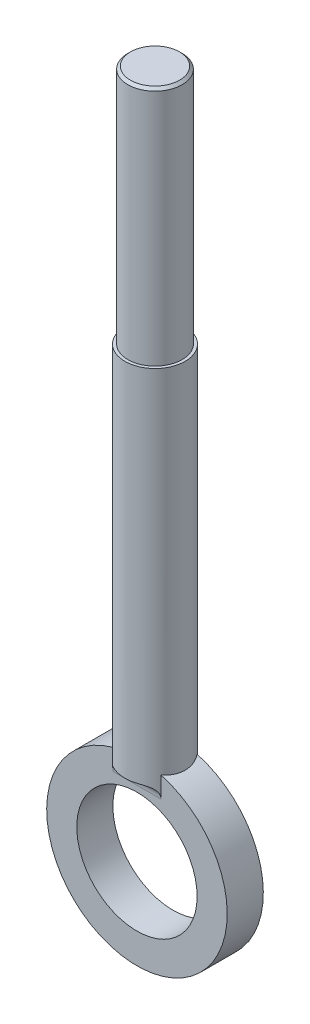
ISO-10303-21;
HEADER;
FILE_DESCRIPTION(('STEP AP214'),'2;1');
FILE_NAME('part.step','',(''),(''),'','','');
FILE_SCHEMA(('AUTOMOTIVE_DESIGN { 1 0 10303 214 1 1 1 1 }'));
ENDSEC;
DATA;
#1=APPLICATION_CONTEXT('core data for automotive mechanical design processes');
#2=APPLICATION_PROTOCOL_DEFINITION('international standard','automotive_design',2000,#1);
#3=PRODUCT_CONTEXT('',#1,'mechanical');
#4=PRODUCT('Part','Part','',(#3));
#5=PRODUCT_RELATED_PRODUCT_CATEGORY('part','',(#4));
#6=PRODUCT_DEFINITION_FORMATION('','',#4);
#7=PRODUCT_DEFINITION_CONTEXT('part definition',#1,'design');
#8=PRODUCT_DEFINITION('design','',#6,#7);
#9=PRODUCT_DEFINITION_SHAPE('','',#8);
#10=(LENGTH_UNIT() NAMED_UNIT(*) SI_UNIT(.MILLI.,.METRE.));
#11=(NAMED_UNIT(*) PLANE_ANGLE_UNIT() SI_UNIT($,.RADIAN.));
#12=(NAMED_UNIT(*) SI_UNIT($,.STERADIAN.) SOLID_ANGLE_UNIT());
#13=UNCERTAINTY_MEASURE_WITH_UNIT(LENGTH_MEASURE(1.E-05),#10,'distance_accuracy_value','');
#14=(GEOMETRIC_REPRESENTATION_CONTEXT(3) GLOBAL_UNCERTAINTY_ASSIGNED_CONTEXT((#13)) GLOBAL_UNIT_ASSIGNED_CONTEXT((#10,
#11,#12)) REPRESENTATION_CONTEXT('',''));
#15=CARTESIAN_POINT('',(0.,0.,0.));
#16=DIRECTION('',(0.,0.,1.));
#17=DIRECTION('',(1.,0.,0.));
#18=AXIS2_PLACEMENT_3D('',#15,#16,#17);
#19=CARTESIAN_POINT('',(0.,50.,0.));
#20=DIRECTION('',(0.,-1.,0.));
#21=DIRECTION('',(0.,0.,-1.));
#22=AXIS2_PLACEMENT_3D('',#19,#20,#21);
#23=CYLINDRICAL_SURFACE('',#22,2.5);
#24=CARTESIAN_POINT('',(0.,30.,0.));
#25=DIRECTION('',(0.,-1.,0.));
#26=DIRECTION('',(0.,0.,-1.));
#27=AXIS2_PLACEMENT_3D('',#24,#25,#26);
#28=CIRCLE('',#27,2.5);
#29=CARTESIAN_POINT('',(0.,30.,-2.5));
#30=VERTEX_POINT('',#29);
#31=EDGE_CURVE('E161',#30,#30,#28,.T.);
#32=ORIENTED_EDGE('',*,*,#31,.T.);
#33=EDGE_LOOP('',(#32));
#34=FACE_BOUND('',#33,.T.);
#35=DIRECTION('',(0.,-1.,0.));
#36=VECTOR('',#35,1.);
#37=CARTESIAN_POINT('',(-2.,50.,-1.5));
#38=LINE('',#37,#36);
#39=CARTESIAN_POINT('',(-2.,0.728416147400481,-1.5));
#40=VERTEX_POINT('',#39);
#41=CARTESIAN_POINT('',(-2.,-1.,-1.5));
#42=VERTEX_POINT('',#41);
#43=EDGE_CURVE('E108',#40,#42,#38,.T.);
#44=ORIENTED_EDGE('',*,*,#43,.F.);
#45=CARTESIAN_POINT('',(0.,1.,-2.5));
#46=CARTESIAN_POINT('',(-0.136408407216808,1.0000003825236,-2.5000006343291));
#47=CARTESIAN_POINT('',(-0.272812986346375,0.996244237688619,-2.48879933468196));
#48=CARTESIAN_POINT('',(-0.54160440218243,0.981630255082018,-2.44442722795695));
#49=CARTESIAN_POINT('',(-0.673990820297044,0.970771680053813,-2.41125414012769));
#50=CARTESIAN_POINT('',(-0.93083197375444,0.943132697661065,-2.32420189153988));
#51=CARTESIAN_POINT('',(-1.05529956471509,0.926362193271333,-2.27035734385182));
#52=CARTESIAN_POINT('',(-1.29343734201331,0.888611142933544,-2.14364706790413));
#53=CARTESIAN_POINT('',(-1.40710539239676,0.867629766694449,-2.0707775874935));
#54=CARTESIAN_POINT('',(-1.62435418755567,0.822852361075126,-1.90543548785312));
#55=CARTESIAN_POINT('',(-1.72750925074577,0.798988911594621,-1.81242191434877));
#56=CARTESIAN_POINT('',(-1.91708173175521,0.751507869578036,-1.61058211323358));
#57=CARTESIAN_POINT('',(-2.00349546372366,0.727890332263727,-1.50175241267872));
#58=CARTESIAN_POINT('',(-2.15956235556965,0.682833311931844,-1.26753721200885));
#59=CARTESIAN_POINT('',(-2.22866214555258,0.661475981892204,-1.14176565066969));
#60=CARTESIAN_POINT('',(-2.3445471846943,0.624382635465029,-0.879559763853632));
#61=CARTESIAN_POINT('',(-2.39133924346691,0.608644904018641,-0.74312870709314));
#62=CARTESIAN_POINT('',(-2.45968365377291,0.585282581734432,-0.468316946258224));
#63=CARTESIAN_POINT('',(-2.48203362067942,0.577402394240282,-0.330156978777338));
#64=CARTESIAN_POINT('',(-2.50335280833619,0.569891415737688,-0.0518406146102977));
#65=CARTESIAN_POINT('',(-2.50232925401179,0.570258075568249,0.0883151517729762));
#66=CARTESIAN_POINT('',(-2.47754975925855,0.578975375204504,0.359841576110053));
#67=CARTESIAN_POINT('',(-2.45483478291749,0.586960396688323,0.491321007297546));
#68=CARTESIAN_POINT('',(-2.38901540712354,0.609416443113773,0.748483549017085));
#69=CARTESIAN_POINT('',(-2.34590856647968,0.62388824460269,0.874165963587674));
#70=CARTESIAN_POINT('',(-2.23984764515053,0.65794777828122,1.1185318739787));
#71=CARTESIAN_POINT('',(-2.17658512176816,0.677614144827934,1.23707006367381));
#72=CARTESIAN_POINT('',(-2.03222276575785,0.719813964393161,1.46217727069931));
#73=CARTESIAN_POINT('',(-1.95111778091001,0.742348244761589,1.56874281733345));
#74=CARTESIAN_POINT('',(-1.76837333170559,0.789183229193522,1.77272899540193));
#75=CARTESIAN_POINT('',(-1.66588287519078,0.813514733871071,1.86938173627267));
#76=CARTESIAN_POINT('',(-1.44584892492516,0.860173459675917,2.04432816665849));
#77=CARTESIAN_POINT('',(-1.32830398915204,0.882500488451685,2.12262009541124));
#78=CARTESIAN_POINT('',(-1.07986903261567,0.92292769844484,2.25924075058767));
#79=CARTESIAN_POINT('',(-0.948858191040841,0.94098375020098,2.31736372835183));
#80=CARTESIAN_POINT('',(-0.678172708411269,0.97051417861087,2.41050793488928));
#81=CARTESIAN_POINT('',(-0.538501095387384,0.98199084137198,2.44553718855859));
#82=CARTESIAN_POINT('',(-0.26095957382326,0.99669067678601,2.4901391650559));
#83=CARTESIAN_POINT('',(-0.123273999662116,1.0002500458432,2.50074952293188));
#84=CARTESIAN_POINT('',(0.151937674900593,0.999722567370685,2.49916831600383));
#85=CARTESIAN_POINT('',(0.289463798299125,0.995637010484057,2.48698060005031));
#86=CARTESIAN_POINT('',(0.556299665760637,0.980500617927606,2.4409702306601));
#87=CARTESIAN_POINT('',(0.685732017087107,0.969654967779807,2.40778448487626));
#88=CARTESIAN_POINT('',(0.937139896448932,0.942296170751748,2.32151638883318));
#89=CARTESIAN_POINT('',(1.05911447127151,0.925782301166876,2.26843150133054));
#90=CARTESIAN_POINT('',(1.29572074098318,0.888223282182245,2.14232392039803));
#91=CARTESIAN_POINT('',(1.41007489804287,0.867070368894653,2.06881351679207));
#92=CARTESIAN_POINT('',(1.62516207533896,0.822631347906562,1.90451462496629));
#93=CARTESIAN_POINT('',(1.72589091948894,0.79934458984569,1.81372085992059));
#94=CARTESIAN_POINT('',(1.91563126951575,0.751921199511118,1.61255312248353));
#95=CARTESIAN_POINT('',(2.00390242311443,0.727794027185698,1.50147693268285));
#96=CARTESIAN_POINT('',(2.16064380580894,0.682499332367717,1.26557108047278));
#97=CARTESIAN_POINT('',(2.22911386982753,0.661331834550058,1.14074130341481));
#98=CARTESIAN_POINT('',(2.3439923260409,0.624559794784588,0.88081746177526));
#99=CARTESIAN_POINT('',(2.39044533041255,0.60894401982447,0.745744802078086));
#100=CARTESIAN_POINT('',(2.45973666689839,0.585270807661238,0.469053374889674));
#101=CARTESIAN_POINT('',(2.48258563738485,0.577209965590984,0.327437586489127));
#102=CARTESIAN_POINT('',(2.50319070619335,0.56994647185443,0.0495072598977102));
#103=CARTESIAN_POINT('',(2.502175643271,0.570310006435378,-0.0867058507170575));
#104=CARTESIAN_POINT('',(2.47810573362173,0.578781745596685,-0.356912687305155));
#105=CARTESIAN_POINT('',(2.45505219864646,0.586889489234042,-0.49090654488772));
#106=CARTESIAN_POINT('',(2.38842953282336,0.609613107622292,-0.750339157506179));
#107=CARTESIAN_POINT('',(2.34525836503878,0.624102450561938,-0.875892062511239));
#108=CARTESIAN_POINT('',(2.23994841439937,0.657909970461713,-1.11806851734567));
#109=CARTESIAN_POINT('',(2.17780542138451,0.677229219084828,-1.23469007797002));
#110=CARTESIAN_POINT('',(2.03315173145857,0.719570730651156,-1.46120917480728));
#111=CARTESIAN_POINT('',(1.94987060691145,0.742717791053426,-1.57059125474596));
#112=CARTESIAN_POINT('',(1.76660720783912,0.789583907081321,-1.7742245334605));
#113=CARTESIAN_POINT('',(1.6666202111287,0.813303122809307,-1.86847143922019));
#114=CARTESIAN_POINT('',(1.44810389230172,0.859750763138604,-2.04286103072294));
#115=CARTESIAN_POINT('',(1.32900378374932,0.882404545031416,-2.1223108693775));
#116=CARTESIAN_POINT('',(1.07839339351656,0.923149779315301,-2.25997607212662));
#117=CARTESIAN_POINT('',(0.946886295330872,0.941242397698245,-2.3181968648051));
#118=CARTESIAN_POINT('',(0.68123411800244,0.970137876713546,-2.40930408122168));
#119=CARTESIAN_POINT('',(0.547469394191021,0.981230310563067,-2.44320616565844));
#120=CARTESIAN_POINT('',(0.275801040025617,0.996160176605546,-2.48855070169281));
#121=CARTESIAN_POINT('',(0.137898563921866,0.999999613297624,-2.49999935874134));
#122=CARTESIAN_POINT('',(0.,1.,-2.5));
#123=B_SPLINE_CURVE_WITH_KNOTS('',3,(#45,#46,#47,#48,#49,#50,#51,#52,#53,#54,#55,#56,#57,#58,
#59,#60,#61,#62,#63,#64,#65,#66,#67,#68,#69,#70,#71,#72,#73,#74,#75,#76,#77,#78,#79,#80,#81,#82,
#83,#84,#85,#86,#87,#88,#89,#90,#91,#92,#93,#94,#95,#96,#97,#98,#99,#100,#101,#102,#103,#104,
#105,#106,#107,#108,#109,#110,#111,#112,#113,#114,#115,#116,#117,#118,#119,#120,#121,#122),
.UNSPECIFIED.,.T.,.F.,(4,2,2,2,2,2,2,2,2,2,2,2,2,2,2,2,2,2,2,2,2,2,2,2,2,2,2,2,2,2,2,2,2,2,2,2,
2,2,4),(0.,0.408717765065027,0.817477963168801,1.22555668217568,1.63371594449775,
2.0546171070689,2.47561083218826,2.90870962058676,3.34167611732083,3.760048143546,
4.17829084968713,4.577420663782,4.97659827138705,5.38220427887826,5.78792756395518,
6.21483264528417,6.64177864916546,7.07296014125894,7.5039917219302,7.91633957937924,
8.32861782910441,8.72895394945533,9.12934113210259,9.54025999609341,9.95130452054728,
10.3810255720188,10.8107502058749,11.2396003456693,11.668257117646,12.0748916516065,
12.4815019837844,12.8803896770104,13.2793659543994,13.6957516672951,14.1122552780945,
14.5449915208775,14.9776170288114,15.3909139593453,15.8040966509535),.UNSPECIFIED.);
#124=CARTESIAN_POINT('',(-2.,0.728416147400481,1.5));
#125=VERTEX_POINT('',#124);
#126=EDGE_CURVE('E107',#40,#125,#123,.T.);
#127=ORIENTED_EDGE('',*,*,#126,.T.);
#128=DIRECTION('',(0.,-1.,0.));
#129=VECTOR('',#128,1.);
#130=CARTESIAN_POINT('',(-2.,50.,1.5));
#131=LINE('',#130,#129);
#132=CARTESIAN_POINT('',(-2.,-1.,1.5));
#133=VERTEX_POINT('',#132);
#134=EDGE_CURVE('E111',#125,#133,#131,.T.);
#135=ORIENTED_EDGE('',*,*,#134,.T.);
#136=CARTESIAN_POINT('',(-2.,-1.,1.5));
#137=CARTESIAN_POINT('',(-1.99999876577342,-0.97676225149139,1.49999830084557));
#138=CARTESIAN_POINT('',(-1.99939222254472,-0.953536308819546,1.50081072058559));
#139=CARTESIAN_POINT('',(-1.99696568946245,-0.907264468753069,1.50403926587182));
#140=CARTESIAN_POINT('',(-1.99514593772813,-0.884218536925133,1.50645507671632));
#141=CARTESIAN_POINT('',(-1.98788221987231,-0.815759602078507,1.5160449621284));
#142=CARTESIAN_POINT('',(-1.98063378832018,-0.770832093704825,1.52556192920814));
#143=CARTESIAN_POINT('',(-1.96135768732922,-0.683683781130424,1.55026368463543));
#144=CARTESIAN_POINT('',(-1.94933054307276,-0.641462680086458,1.56544785014457));
#145=CARTESIAN_POINT('',(-1.92060500353691,-0.560747353683061,1.60055891928685));
#146=CARTESIAN_POINT('',(-1.90390550189449,-0.522254013926215,1.62048694604742));
#147=CARTESIAN_POINT('',(-1.8655642210059,-0.448809561599657,1.66449377708559));
#148=CARTESIAN_POINT('',(-1.84380444693772,-0.413977638233013,1.68866762969594));
#149=CARTESIAN_POINT('',(-1.79598412356434,-0.34942934593038,1.73944251511171));
#150=CARTESIAN_POINT('',(-1.76992133886495,-0.319715652371747,1.76604480625132));
#151=CARTESIAN_POINT('',(-1.70282056041735,-0.254605991726268,1.83121713206997));
#152=CARTESIAN_POINT('',(-1.65994913666013,-0.221649805543534,1.87033920684536));
#153=CARTESIAN_POINT('',(-1.56811242052649,-0.164767780457878,1.94798747224093));
#154=CARTESIAN_POINT('',(-1.51913642777315,-0.140858103247096,1.98651247957849));
#155=CARTESIAN_POINT('',(-1.43107648771638,-0.106263089760478,2.05038747818235));
#156=CARTESIAN_POINT('',(-1.3931377213115,-0.0937505866711835,2.07636980470312));
#157=CARTESIAN_POINT('',(-1.31522219267615,-0.071934583669212,2.12657994269479));
#158=CARTESIAN_POINT('',(-1.2752445398744,-0.0626325000648118,2.15080697608663));
#159=CARTESIAN_POINT('',(-1.15260387917798,-0.0386093300991319,2.22043345824846));
#160=CARTESIAN_POINT('',(-1.06735328624028,-0.0278137690861297,2.26269041498312));
#161=CARTESIAN_POINT('',(-0.918304249672437,-0.0148598287067491,2.32620256664635));
#162=CARTESIAN_POINT('',(-0.855658332747251,-0.0110881716216496,2.34996728629104));
#163=CARTESIAN_POINT('',(-0.728538148866373,-0.00557114346597338,2.39242889075479));
#164=CARTESIAN_POINT('',(-0.664063015465104,-0.00382674963725299,2.41112332811937));
#165=CARTESIAN_POINT('',(-0.533896458793061,-0.00148243349274305,2.44324512662257));
#166=CARTESIAN_POINT('',(-0.468206760857007,-0.000880997357431536,2.45667943590986));
#167=CARTESIAN_POINT('',(-0.335989634988424,-0.000178686641797203,2.47822361899857));
#168=CARTESIAN_POINT('',(-0.269462733477933,-7.75118670290784E-05,2.48633668341112));
#169=CARTESIAN_POINT('',(-0.168986828099427,-1.1840965284829E-05,2.49451214519894));
#170=CARTESIAN_POINT('',(-0.135189174611832,-4.50495384289952E-06,2.49657170199025));
#171=CARTESIAN_POINT('',(-0.0675955437350746,2.76106166190426E-07,2.49931444186999));
#172=CARTESIAN_POINT('',(-0.0337996609302274,-2.26207288891659E-06,2.49999995591882));
#173=CARTESIAN_POINT('',(0.,0.,2.5));
#174=B_SPLINE_CURVE_WITH_KNOTS('',3,(#136,#137,#138,#139,#140,#141,#142,#143,#144,#145,#146,
#147,#148,#149,#150,#151,#152,#153,#154,#155,#156,#157,#158,#159,#160,#161,#162,#163,#164,#165,
#166,#167,#168,#169,#170,#171,#172,#173),.UNSPECIFIED.,.F.,.F.,(4,2,2,2,2,2,2,2,2,2,2,2,2,2,2,2,
2,2,4),(0.,0.0696679256697032,0.139322181478205,0.278058417432403,0.416779410436504,
0.555533278891727,0.697921487377381,0.840383899982874,1.0395031865621,1.23897654099019,
1.38175148916954,1.52458934365607,1.81072382391384,2.01183769876063,2.21304848035171,
2.41399257693819,2.61481607730566,2.71637299528517,2.81775748326735),.UNSPECIFIED.);
#175=CARTESIAN_POINT('',(0.,0.,2.5));
#176=VERTEX_POINT('',#175);
#177=EDGE_CURVE('E11',#133,#176,#174,.T.);
#178=ORIENTED_EDGE('',*,*,#177,.T.);
#179=CARTESIAN_POINT('',(0.,0.,2.5));
#180=CARTESIAN_POINT('',(0.0349463276174826,-2.58721338670035E-06,2.5000000597369));
#181=CARTESIAN_POINT('',(0.069888684787882,3.13420399071013E-07,2.49926717858351));
#182=CARTESIAN_POINT('',(0.139711327944131,-5.14276056735741E-06,2.49633767314956));
#183=CARTESIAN_POINT('',(0.174591615079841,-1.34993645566535E-05,2.49414107627372));
#184=CARTESIAN_POINT('',(0.279086404267144,-8.882164115308E-05,2.48535667104289));
#185=CARTESIAN_POINT('',(0.348528399610689,-0.00020607136882789,2.47657425082874));
#186=CARTESIAN_POINT('',(0.486965770610719,-0.00102980398859722,2.45312652750474));
#187=CARTESIAN_POINT('',(0.555953415920908,-0.00174088415415931,2.43841579017993));
#188=CARTESIAN_POINT('',(0.692372474016579,-0.00453676680161278,2.40324533658573));
#189=CARTESIAN_POINT('',(0.759804545499893,-0.00662097636379104,2.38278810384935));
#190=CARTESIAN_POINT('',(0.922903219330311,-0.0147119577515706,2.32566130885523));
#191=CARTESIAN_POINT('',(1.01745923600743,-0.0220718389727831,2.28585009023617));
#192=CARTESIAN_POINT('',(1.1541723631408,-0.0402448687236962,2.21821419095569));
#193=CARTESIAN_POINT('',(1.19882669005893,-0.0474752321410823,2.19439073038703));
#194=CARTESIAN_POINT('',(1.28615549505793,-0.0649958269502634,2.14437217425247));
#195=CARTESIAN_POINT('',(1.32883080281116,-0.075284762430155,2.11817808638027));
#196=CARTESIAN_POINT('',(1.42661093892282,-0.104006755377003,2.0540931924232));
#197=CARTESIAN_POINT('',(1.48072154547159,-0.124035622131926,2.01536220988538));
#198=CARTESIAN_POINT('',(1.58318427963768,-0.172981343934967,1.93590102266277));
#199=CARTESIAN_POINT('',(1.6315434542596,-0.201887163462787,1.89517335272595));
#200=CARTESIAN_POINT('',(1.7119692777504,-0.26327029255742,1.82249573185387));
#201=CARTESIAN_POINT('',(1.74535687146461,-0.293861456030289,1.7904271242763));
#202=CARTESIAN_POINT('',(1.80666434055933,-0.362059590803126,1.72854222983696));
#203=CARTESIAN_POINT('',(1.83458686224112,-0.399663149244246,1.69872485719837));
#204=CARTESIAN_POINT('',(1.88447319082456,-0.481921995355484,1.64321956290411));
#205=CARTESIAN_POINT('',(1.90638869675024,-0.526630124257999,1.61756575429816));
#206=CARTESIAN_POINT('',(1.94348547963377,-0.621757374782929,1.57280551148363));
#207=CARTESIAN_POINT('',(1.95867175259243,-0.672172224519384,1.55369422230204));
#208=CARTESIAN_POINT('',(1.98023376024385,-0.768522245658809,1.52608370621193));
#209=CARTESIAN_POINT('',(1.98763077539047,-0.813882474226387,1.51637538532965));
#210=CARTESIAN_POINT('',(1.99504453797238,-0.883026314529384,1.50658963287154));
#211=CARTESIAN_POINT('',(1.99690216950692,-0.906305335171752,1.5041237212072));
#212=CARTESIAN_POINT('',(1.99937965426558,-0.953052563338635,1.5008274573904));
#213=CARTESIAN_POINT('',(1.99999906858128,-0.976520834988054,1.4999976851985));
#214=CARTESIAN_POINT('',(2.,-1.,1.5));
#215=B_SPLINE_CURVE_WITH_KNOTS('',3,(#179,#180,#181,#182,#183,#184,#185,#186,#187,#188,#189,
#190,#191,#192,#193,#194,#195,#196,#197,#198,#199,#200,#201,#202,#203,#204,#205,#206,#207,#208,
#209,#210,#211,#212,#213,#214),.UNSPECIFIED.,.F.,.F.,(4,2,2,2,2,2,2,2,2,2,2,2,2,2,2,2,2,4),(0.,
0.10482337159326,0.209644780665024,0.419366648444142,0.630727341674597,0.841996828746439,
1.14937589837538,1.30260592853889,1.45577112770486,1.66355371671508,1.87107903615506,
2.03688558424836,2.20261164565306,2.36963358890554,2.53653132103012,2.67671007994139,
2.74707846190556,2.81747178279152),.UNSPECIFIED.);
#216=CARTESIAN_POINT('',(2.,-1.,1.5));
#217=VERTEX_POINT('',#216);
#218=EDGE_CURVE('E60',#176,#217,#215,.T.);
#219=ORIENTED_EDGE('',*,*,#218,.T.);
#220=DIRECTION('',(0.,-1.,0.));
#221=VECTOR('',#220,1.);
#222=CARTESIAN_POINT('',(2.,50.,1.5));
#223=LINE('',#222,#221);
#224=CARTESIAN_POINT('',(2.,0.728416147400481,1.5));
#225=VERTEX_POINT('',#224);
#226=EDGE_CURVE('E73',#217,#225,#223,.F.);
#227=ORIENTED_EDGE('',*,*,#226,.T.);
#228=CARTESIAN_POINT('',(2.,0.728416147400481,-1.5));
#229=VERTEX_POINT('',#228);
#230=EDGE_CURVE('E100',#225,#229,#123,.T.);
#231=ORIENTED_EDGE('',*,*,#230,.T.);
#232=DIRECTION('',(0.,-1.,0.));
#233=VECTOR('',#232,1.);
#234=CARTESIAN_POINT('',(2.,50.,-1.5));
#235=LINE('',#234,#233);
#236=CARTESIAN_POINT('',(2.,-1.,-1.5));
#237=VERTEX_POINT('',#236);
#238=EDGE_CURVE('E122',#237,#229,#235,.F.);
#239=ORIENTED_EDGE('',*,*,#238,.F.);
#240=CARTESIAN_POINT('',(2.,-1.,-1.5));
#241=CARTESIAN_POINT('',(1.99999876577342,-0.97676225149139,-1.49999830084557));
#242=CARTESIAN_POINT('',(1.99939222254472,-0.953536308819546,-1.50081072058559));
#243=CARTESIAN_POINT('',(1.99696568946245,-0.907264468753069,-1.50403926587182));
#244=CARTESIAN_POINT('',(1.99514593772813,-0.884218536925133,-1.50645507671632));
#245=CARTESIAN_POINT('',(1.98788221987231,-0.815759602078507,-1.5160449621284));
#246=CARTESIAN_POINT('',(1.98063378832018,-0.770832093704825,-1.52556192920814));
#247=CARTESIAN_POINT('',(1.96135768732922,-0.683683781130424,-1.55026368463543));
#248=CARTESIAN_POINT('',(1.94933054307276,-0.641462680086458,-1.56544785014457));
#249=CARTESIAN_POINT('',(1.92060500353691,-0.560747353683061,-1.60055891928685));
#250=CARTESIAN_POINT('',(1.90390550189449,-0.522254013926215,-1.62048694604742));
#251=CARTESIAN_POINT('',(1.8655642210059,-0.448809561599657,-1.66449377708559));
#252=CARTESIAN_POINT('',(1.84380444693772,-0.413977638233013,-1.68866762969594));
#253=CARTESIAN_POINT('',(1.79598412356434,-0.34942934593038,-1.73944251511171));
#254=CARTESIAN_POINT('',(1.76992133886495,-0.319715652371747,-1.76604480625132));
#255=CARTESIAN_POINT('',(1.70282056041735,-0.254605991726268,-1.83121713206997));
#256=CARTESIAN_POINT('',(1.65994913666013,-0.221649805543534,-1.87033920684536));
#257=CARTESIAN_POINT('',(1.56811242052649,-0.164767780457878,-1.94798747224093));
#258=CARTESIAN_POINT('',(1.51913642777315,-0.140858103247096,-1.98651247957849));
#259=CARTESIAN_POINT('',(1.43107648771638,-0.106263089760478,-2.05038747818235));
#260=CARTESIAN_POINT('',(1.3931377213115,-0.0937505866711835,-2.07636980470312));
#261=CARTESIAN_POINT('',(1.31522219267615,-0.071934583669212,-2.12657994269479));
#262=CARTESIAN_POINT('',(1.2752445398744,-0.0626325000648118,-2.15080697608663));
#263=CARTESIAN_POINT('',(1.15260387917798,-0.0386093300991319,-2.22043345824846));
#264=CARTESIAN_POINT('',(1.06735328624028,-0.0278137690861297,-2.26269041498312));
#265=CARTESIAN_POINT('',(0.918304249672437,-0.0148598287067491,-2.32620256664635));
#266=CARTESIAN_POINT('',(0.855658332747251,-0.0110881716216496,-2.34996728629104));
#267=CARTESIAN_POINT('',(0.728538148866373,-0.00557114346597338,-2.39242889075479));
#268=CARTESIAN_POINT('',(0.664063015465104,-0.00382674963725299,-2.41112332811937));
#269=CARTESIAN_POINT('',(0.533896458793061,-0.00148243349274305,-2.44324512662257));
#270=CARTESIAN_POINT('',(0.468206760857007,-0.000880997357431536,-2.45667943590986));
#271=CARTESIAN_POINT('',(0.335989634988424,-0.000178686641797203,-2.47822361899857));
#272=CARTESIAN_POINT('',(0.269462733477933,-7.75118670290784E-05,-2.48633668341112));
#273=CARTESIAN_POINT('',(0.168986828099427,-1.1840965284829E-05,-2.49451214519894));
#274=CARTESIAN_POINT('',(0.135189174611832,-4.50495384289952E-06,-2.49657170199025));
#275=CARTESIAN_POINT('',(0.0675955437350746,2.76106166190426E-07,-2.49931444186999));
#276=CARTESIAN_POINT('',(0.0337996609302274,-2.26207288891659E-06,-2.49999995591882));
#277=CARTESIAN_POINT('',(0.,0.,-2.5));
#278=B_SPLINE_CURVE_WITH_KNOTS('',3,(#240,#241,#242,#243,#244,#245,#246,#247,#248,#249,#250,
#251,#252,#253,#254,#255,#256,#257,#258,#259,#260,#261,#262,#263,#264,#265,#266,#267,#268,#269,
#270,#271,#272,#273,#274,#275,#276,#277),.UNSPECIFIED.,.F.,.F.,(4,2,2,2,2,2,2,2,2,2,2,2,2,2,2,2,
2,2,4),(0.,0.0696679256697032,0.139322181478205,0.278058417432403,0.416779410436504,
0.555533278891727,0.697921487377381,0.840383899982874,1.0395031865621,1.23897654099019,
1.38175148916954,1.52458934365607,1.81072382391384,2.01183769876063,2.21304848035171,
2.41399257693819,2.61481607730566,2.71637299528517,2.81775748326735),.UNSPECIFIED.);
#279=CARTESIAN_POINT('',(0.,0.,-2.5));
#280=VERTEX_POINT('',#279);
#281=EDGE_CURVE('E274',#237,#280,#278,.T.);
#282=ORIENTED_EDGE('',*,*,#281,.T.);
#283=CARTESIAN_POINT('',(0.,0.,-2.5));
#284=CARTESIAN_POINT('',(-0.0349463276174826,-2.58721338670035E-06,-2.5000000597369));
#285=CARTESIAN_POINT('',(-0.069888684787882,3.13420399071013E-07,-2.49926717858351));
#286=CARTESIAN_POINT('',(-0.139711327944131,-5.14276056735741E-06,-2.49633767314956));
#287=CARTESIAN_POINT('',(-0.174591615079841,-1.34993645566535E-05,-2.49414107627372));
#288=CARTESIAN_POINT('',(-0.279086404267144,-8.882164115308E-05,-2.48535667104289));
#289=CARTESIAN_POINT('',(-0.348528399610689,-0.00020607136882789,-2.47657425082874));
#290=CARTESIAN_POINT('',(-0.486965770610719,-0.00102980398859722,-2.45312652750474));
#291=CARTESIAN_POINT('',(-0.555953415920908,-0.00174088415415931,-2.43841579017993));
#292=CARTESIAN_POINT('',(-0.692372474016579,-0.00453676680161278,-2.40324533658573));
#293=CARTESIAN_POINT('',(-0.759804545499893,-0.00662097636379104,-2.38278810384935));
#294=CARTESIAN_POINT('',(-0.922903219330311,-0.0147119577515706,-2.32566130885523));
#295=CARTESIAN_POINT('',(-1.01745923600743,-0.0220718389727831,-2.28585009023617));
#296=CARTESIAN_POINT('',(-1.1541723631408,-0.0402448687236962,-2.21821419095569));
#297=CARTESIAN_POINT('',(-1.19882669005893,-0.0474752321410823,-2.19439073038703));
#298=CARTESIAN_POINT('',(-1.28615549505793,-0.0649958269502634,-2.14437217425247));
#299=CARTESIAN_POINT('',(-1.32883080281116,-0.075284762430155,-2.11817808638027));
#300=CARTESIAN_POINT('',(-1.42661093892282,-0.104006755377003,-2.0540931924232));
#301=CARTESIAN_POINT('',(-1.48072154547159,-0.124035622131926,-2.01536220988538));
#302=CARTESIAN_POINT('',(-1.58318427963768,-0.172981343934967,-1.93590102266277));
#303=CARTESIAN_POINT('',(-1.6315434542596,-0.201887163462787,-1.89517335272595));
#304=CARTESIAN_POINT('',(-1.7119692777504,-0.26327029255742,-1.82249573185387));
#305=CARTESIAN_POINT('',(-1.74535687146461,-0.293861456030289,-1.7904271242763));
#306=CARTESIAN_POINT('',(-1.80666434055933,-0.362059590803126,-1.72854222983696));
#307=CARTESIAN_POINT('',(-1.83458686224112,-0.399663149244246,-1.69872485719837));
#308=CARTESIAN_POINT('',(-1.88447319082456,-0.481921995355484,-1.64321956290411));
#309=CARTESIAN_POINT('',(-1.90638869675024,-0.526630124257999,-1.61756575429816));
#310=CARTESIAN_POINT('',(-1.94348547963377,-0.621757374782929,-1.57280551148363));
#311=CARTESIAN_POINT('',(-1.95867175259243,-0.672172224519384,-1.55369422230204));
#312=CARTESIAN_POINT('',(-1.98023376024385,-0.768522245658809,-1.52608370621193));
#313=CARTESIAN_POINT('',(-1.98763077539047,-0.813882474226387,-1.51637538532965));
#314=CARTESIAN_POINT('',(-1.99504453797238,-0.883026314529384,-1.50658963287154));
#315=CARTESIAN_POINT('',(-1.99690216950692,-0.906305335171752,-1.5041237212072));
#316=CARTESIAN_POINT('',(-1.99937965426558,-0.953052563338635,-1.5008274573904));
#317=CARTESIAN_POINT('',(-1.99999906858128,-0.976520834988054,-1.4999976851985));
#318=CARTESIAN_POINT('',(-2.,-1.,-1.5));
#319=B_SPLINE_CURVE_WITH_KNOTS('',3,(#283,#284,#285,#286,#287,#288,#289,#290,#291,#292,#293,
#294,#295,#296,#297,#298,#299,#300,#301,#302,#303,#304,#305,#306,#307,#308,#309,#310,#311,#312,
#313,#314,#315,#316,#317,#318),.UNSPECIFIED.,.F.,.F.,(4,2,2,2,2,2,2,2,2,2,2,2,2,2,2,2,2,4),(0.,
0.10482337159326,0.209644780665024,0.419366648444142,0.630727341674597,0.841996828746439,
1.14937589837538,1.30260592853889,1.45577112770486,1.66355371671508,1.87107903615506,
2.03688558424836,2.20261164565306,2.36963358890554,2.53653132103012,2.67671007994139,
2.74707846190556,2.81747178279152),.UNSPECIFIED.);
#320=EDGE_CURVE('E280',#280,#42,#319,.T.);
#321=ORIENTED_EDGE('',*,*,#320,.T.);
#322=EDGE_LOOP('',(#44,#127,#135,#178,#219,#227,#231,#239,#282,#321));
#323=FACE_BOUND('',#322,.T.);
#324=ADVANCED_FACE('F45',(#34,#323),#23,.T.);
#325=CARTESIAN_POINT('',(0.,-6.5,-1.5));
#326=DIRECTION('',(0.,0.,1.));
#327=DIRECTION('',(1.,0.,0.));
#328=AXIS2_PLACEMENT_3D('',#325,#326,#327);
#329=CYLINDRICAL_SURFACE('',#328,7.5);
#330=ORIENTED_EDGE('',*,*,#126,.F.);
#331=CARTESIAN_POINT('',(0.,-6.5,-1.5));
#332=DIRECTION('',(0.,0.,1.));
#333=DIRECTION('',(1.,0.,0.));
#334=AXIS2_PLACEMENT_3D('',#331,#332,#333);
#335=CIRCLE('',#334,7.5);
#336=EDGE_CURVE('E105',#40,#229,#335,.T.);
#337=ORIENTED_EDGE('',*,*,#336,.T.);
#338=ORIENTED_EDGE('',*,*,#230,.F.);
#339=CARTESIAN_POINT('',(0.,-6.5,1.5));
#340=DIRECTION('',(0.,0.,1.));
#341=DIRECTION('',(1.,0.,0.));
#342=AXIS2_PLACEMENT_3D('',#339,#340,#341);
#343=CIRCLE('',#342,7.5);
#344=EDGE_CURVE('E102',#125,#225,#343,.T.);
#345=ORIENTED_EDGE('',*,*,#344,.F.);
#346=EDGE_LOOP('',(#330,#337,#338,#345));
#347=FACE_BOUND('',#346,.T.);
#348=ADVANCED_FACE('F101',(#347),#329,.T.);
#349=CARTESIAN_POINT('',(0.,-6.5,-1.5));
#350=DIRECTION('',(0.,0.,1.));
#351=DIRECTION('',(1.,0.,0.));
#352=AXIS2_PLACEMENT_3D('',#349,#350,#351);
#353=PLANE('',#352);
#354=CARTESIAN_POINT('',(0.,-6.5,-1.5));
#355=DIRECTION('',(0.,0.,1.));
#356=DIRECTION('',(1.,0.,0.));
#357=AXIS2_PLACEMENT_3D('',#354,#355,#356);
#358=CIRCLE('',#357,5.);
#359=CARTESIAN_POINT('',(5.,-6.5,-1.5));
#360=VERTEX_POINT('',#359);
#361=EDGE_CURVE('E113',#360,#360,#358,.T.);
#362=ORIENTED_EDGE('',*,*,#361,.T.);
#363=EDGE_LOOP('',(#362));
#364=FACE_BOUND('',#363,.T.);
#365=DIRECTION('',(1.,0.,0.));
#366=VECTOR('',#365,1.);
#367=CARTESIAN_POINT('',(2.,-1.,-1.5));
#368=LINE('',#367,#366);
#369=EDGE_CURVE('E135',#42,#237,#368,.T.);
#370=ORIENTED_EDGE('',*,*,#369,.T.);
#371=ORIENTED_EDGE('',*,*,#238,.T.);
#372=ORIENTED_EDGE('',*,*,#336,.F.);
#373=ORIENTED_EDGE('',*,*,#43,.T.);
#374=EDGE_LOOP('',(#370,#371,#372,#373));
#375=FACE_BOUND('',#374,.T.);
#376=ADVANCED_FACE('F142',(#364,#375),#353,.F.);
#377=CARTESIAN_POINT('',(0.,-6.5,1.5));
#378=DIRECTION('',(0.,0.,1.));
#379=DIRECTION('',(1.,0.,0.));
#380=AXIS2_PLACEMENT_3D('',#377,#378,#379);
#381=PLANE('',#380);
#382=CARTESIAN_POINT('',(0.,-6.5,1.5));
#383=DIRECTION('',(0.,0.,1.));
#384=DIRECTION('',(1.,0.,0.));
#385=AXIS2_PLACEMENT_3D('',#382,#383,#384);
#386=CIRCLE('',#385,5.);
#387=CARTESIAN_POINT('',(5.,-6.5,1.5));
#388=VERTEX_POINT('',#387);
#389=EDGE_CURVE('E114',#388,#388,#386,.T.);
#390=ORIENTED_EDGE('',*,*,#389,.F.);
#391=EDGE_LOOP('',(#390));
#392=FACE_BOUND('',#391,.T.);
#393=ORIENTED_EDGE('',*,*,#226,.F.);
#394=DIRECTION('',(1.,0.,0.));
#395=VECTOR('',#394,1.);
#396=CARTESIAN_POINT('',(0.,-1.,1.5));
#397=LINE('',#396,#395);
#398=EDGE_CURVE('E288',#217,#133,#397,.F.);
#399=ORIENTED_EDGE('',*,*,#398,.T.);
#400=ORIENTED_EDGE('',*,*,#134,.F.);
#401=ORIENTED_EDGE('',*,*,#344,.T.);
#402=EDGE_LOOP('',(#393,#399,#400,#401));
#403=FACE_BOUND('',#402,.T.);
#404=ADVANCED_FACE('F110',(#392,#403),#381,.T.);
#405=CARTESIAN_POINT('',(0.,-6.5,-1.5));
#406=DIRECTION('',(0.,0.,1.));
#407=DIRECTION('',(1.,0.,0.));
#408=AXIS2_PLACEMENT_3D('',#405,#406,#407);
#409=CYLINDRICAL_SURFACE('',#408,5.);
#410=ORIENTED_EDGE('',*,*,#361,.F.);
#411=EDGE_LOOP('',(#410));
#412=FACE_BOUND('',#411,.T.);
#413=ORIENTED_EDGE('',*,*,#389,.T.);
#414=EDGE_LOOP('',(#413));
#415=FACE_BOUND('',#414,.T.);
#416=ADVANCED_FACE('F184',(#412,#415),#409,.F.);
#417=CARTESIAN_POINT('',(0.,-1.,-2.5));
#418=DIRECTION('',(-1.,0.,0.));
#419=DIRECTION('',(0.,0.,1.));
#420=AXIS2_PLACEMENT_3D('',#417,#418,#419);
#421=CYLINDRICAL_SURFACE('',#420,1.);
#422=ORIENTED_EDGE('',*,*,#369,.F.);
#423=ORIENTED_EDGE('',*,*,#320,.F.);
#424=ORIENTED_EDGE('',*,*,#281,.F.);
#425=EDGE_LOOP('',(#422,#423,#424));
#426=FACE_BOUND('',#425,.T.);
#427=ADVANCED_FACE('F187',(#426),#421,.F.);
#428=CARTESIAN_POINT('',(0.,-1.,2.5));
#429=DIRECTION('',(1.,0.,0.));
#430=DIRECTION('',(0.,0.,-1.));
#431=AXIS2_PLACEMENT_3D('',#428,#429,#430);
#432=CYLINDRICAL_SURFACE('',#431,1.);
#433=ORIENTED_EDGE('',*,*,#177,.F.);
#434=ORIENTED_EDGE('',*,*,#398,.F.);
#435=ORIENTED_EDGE('',*,*,#218,.F.);
#436=EDGE_LOOP('',(#433,#434,#435));
#437=FACE_BOUND('',#436,.T.);
#438=ADVANCED_FACE('F47',(#437),#432,.F.);
#439=CARTESIAN_POINT('',(0.,50.,0.));
#440=DIRECTION('',(0.,-1.,0.));
#441=DIRECTION('',(0.,0.,-1.));
#442=AXIS2_PLACEMENT_3D('',#439,#440,#441);
#443=CYLINDRICAL_SURFACE('',#442,2.2565);
#444=CARTESIAN_POINT('',(0.,30.,0.));
#445=DIRECTION('',(0.,-1.,0.));
#446=DIRECTION('',(0.,0.,-1.));
#447=AXIS2_PLACEMENT_3D('',#444,#445,#446);
#448=CIRCLE('',#447,2.2565);
#449=CARTESIAN_POINT('',(0.,30.,-2.2565));
#450=VERTEX_POINT('',#449);
#451=EDGE_CURVE('E164',#450,#450,#448,.T.);
#452=ORIENTED_EDGE('',*,*,#451,.F.);
#453=EDGE_LOOP('',(#452));
#454=FACE_BOUND('',#453,.T.);
#455=CARTESIAN_POINT('',(0.,49.7835,0.));
#456=DIRECTION('',(0.,-1.,0.));
#457=DIRECTION('',(0.,0.,-1.));
#458=AXIS2_PLACEMENT_3D('',#455,#456,#457);
#459=CIRCLE('',#458,2.2565);
#460=CARTESIAN_POINT('',(0.,49.7835,-2.2565));
#461=VERTEX_POINT('',#460);
#462=EDGE_CURVE('E172',#461,#461,#459,.T.);
#463=ORIENTED_EDGE('',*,*,#462,.T.);
#464=EDGE_LOOP('',(#463));
#465=FACE_BOUND('',#464,.T.);
#466=ADVANCED_FACE('F196',(#454,#465),#443,.T.);
#467=CARTESIAN_POINT('',(2.2565,30.,0.));
#468=DIRECTION('',(0.,-1.,0.));
#469=DIRECTION('',(0.,0.,-1.));
#470=AXIS2_PLACEMENT_3D('',#467,#468,#469);
#471=PLANE('',#470);
#472=ORIENTED_EDGE('',*,*,#31,.F.);
#473=EDGE_LOOP('',(#472));
#474=FACE_BOUND('',#473,.T.);
#475=ORIENTED_EDGE('',*,*,#451,.T.);
#476=EDGE_LOOP('',(#475));
#477=FACE_BOUND('',#476,.T.);
#478=ADVANCED_FACE('F151',(#474,#477),#471,.F.);
#479=CARTESIAN_POINT('',(0.,50.,0.));
#480=DIRECTION('',(0.,-1.,0.));
#481=DIRECTION('',(0.,0.,-1.));
#482=AXIS2_PLACEMENT_3D('',#479,#480,#481);
#483=CONICAL_SURFACE('',#482,2.04,0.785398163397457);
#484=ORIENTED_EDGE('',*,*,#462,.F.);
#485=EDGE_LOOP('',(#484));
#486=FACE_BOUND('',#485,.T.);
#487=CARTESIAN_POINT('',(0.,50.,0.));
#488=DIRECTION('',(0.,-1.,0.));
#489=DIRECTION('',(0.,0.,-1.));
#490=AXIS2_PLACEMENT_3D('',#487,#488,#489);
#491=CIRCLE('',#490,2.04);
#492=CARTESIAN_POINT('',(0.,50.,-2.04));
#493=VERTEX_POINT('',#492);
#494=EDGE_CURVE('E165',#493,#493,#491,.T.);
#495=ORIENTED_EDGE('',*,*,#494,.T.);
#496=EDGE_LOOP('',(#495));
#497=FACE_BOUND('',#496,.T.);
#498=ADVANCED_FACE('F146',(#486,#497),#483,.T.);
#499=CARTESIAN_POINT('',(0.,50.,0.));
#500=DIRECTION('',(0.,1.,0.));
#501=DIRECTION('',(0.,0.,1.));
#502=AXIS2_PLACEMENT_3D('',#499,#500,#501);
#503=PLANE('',#502);
#504=ORIENTED_EDGE('',*,*,#494,.F.);
#505=EDGE_LOOP('',(#504));
#506=FACE_BOUND('',#505,.T.);
#507=ADVANCED_FACE('F144',(#506),#503,.T.);
#508=CLOSED_SHELL('',(#324,#348,#376,#404,#416,#427,#438,#466,#478,#498,#507));
#509=MANIFOLD_SOLID_BREP('B2',#508);
#510=ADVANCED_BREP_SHAPE_REPRESENTATION('',(#18,#509),#14);
#511=SHAPE_DEFINITION_REPRESENTATION(#9,#510);
ENDSEC;
END-ISO-10303-21;
